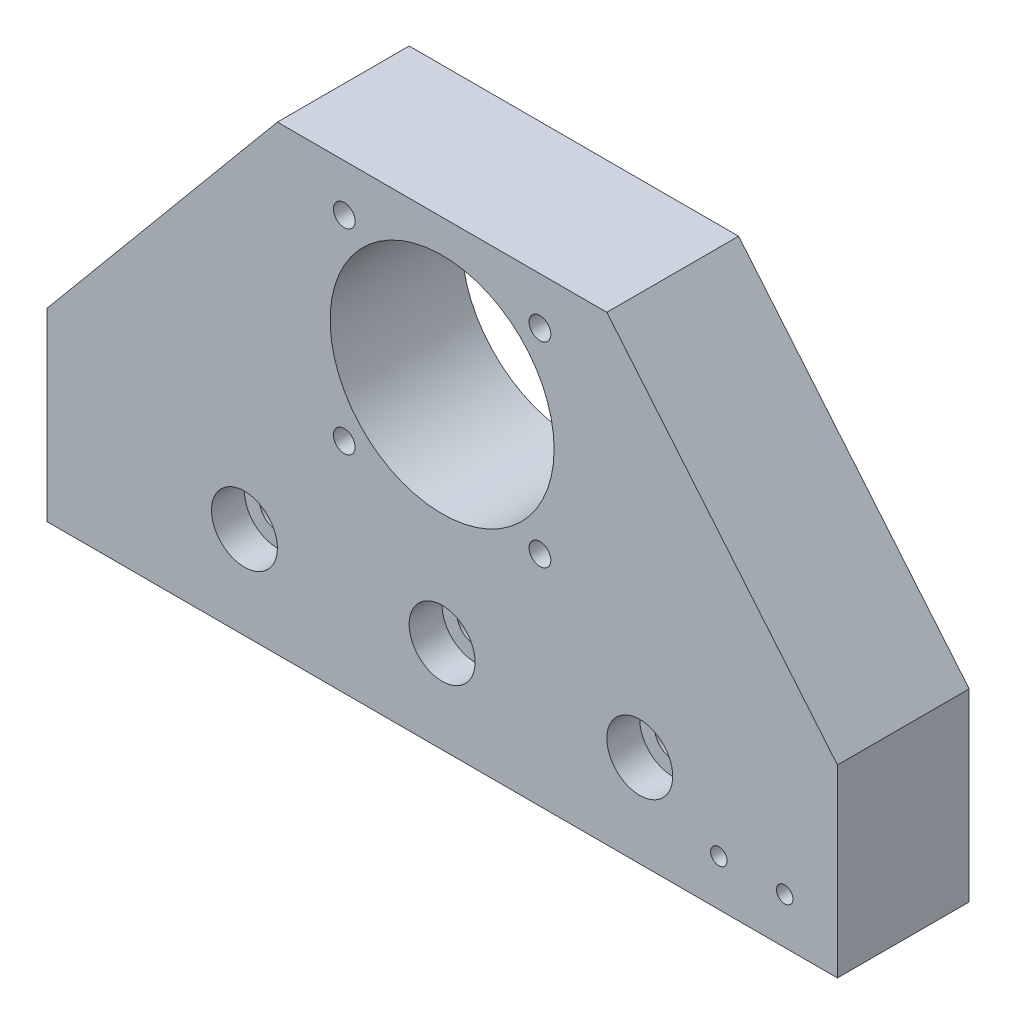
ISO-10303-21;
HEADER;
FILE_DESCRIPTION(('STEP AP214'),'2;1');
FILE_NAME('part.step','',(''),(''),'','','');
FILE_SCHEMA(('AUTOMOTIVE_DESIGN { 1 0 10303 214 1 1 1 1 }'));
ENDSEC;
DATA;
#1=APPLICATION_CONTEXT('core data for automotive mechanical design processes');
#2=APPLICATION_PROTOCOL_DEFINITION('international standard','automotive_design',2000,#1);
#3=PRODUCT_CONTEXT('',#1,'mechanical');
#4=PRODUCT('Part','Part','',(#3));
#5=PRODUCT_RELATED_PRODUCT_CATEGORY('part','',(#4));
#6=PRODUCT_DEFINITION_FORMATION('','',#4);
#7=PRODUCT_DEFINITION_CONTEXT('part definition',#1,'design');
#8=PRODUCT_DEFINITION('design','',#6,#7);
#9=PRODUCT_DEFINITION_SHAPE('','',#8);
#10=(LENGTH_UNIT() NAMED_UNIT(*) SI_UNIT(.MILLI.,.METRE.));
#11=(NAMED_UNIT(*) PLANE_ANGLE_UNIT() SI_UNIT($,.RADIAN.));
#12=(NAMED_UNIT(*) SI_UNIT($,.STERADIAN.) SOLID_ANGLE_UNIT());
#13=UNCERTAINTY_MEASURE_WITH_UNIT(LENGTH_MEASURE(1.E-05),#10,'distance_accuracy_value','');
#14=(GEOMETRIC_REPRESENTATION_CONTEXT(3) GLOBAL_UNCERTAINTY_ASSIGNED_CONTEXT((#13)) GLOBAL_UNIT_ASSIGNED_CONTEXT((#10,
#11,#12)) REPRESENTATION_CONTEXT('',''));
#15=CARTESIAN_POINT('',(0.,0.,0.));
#16=DIRECTION('',(0.,0.,1.));
#17=DIRECTION('',(1.,0.,0.));
#18=AXIS2_PLACEMENT_3D('',#15,#16,#17);
#19=CARTESIAN_POINT('',(-60.,0.,20.));
#20=DIRECTION('',(1.,0.,0.));
#21=DIRECTION('',(0.,0.,-1.));
#22=AXIS2_PLACEMENT_3D('',#19,#20,#21);
#23=PLANE('',#22);
#24=DIRECTION('',(0.,-1.,0.));
#25=VECTOR('',#24,1.);
#26=CARTESIAN_POINT('',(-60.,0.,0.));
#27=LINE('',#26,#25);
#28=CARTESIAN_POINT('',(-60.,28.,0.));
#29=VERTEX_POINT('',#28);
#30=CARTESIAN_POINT('',(-60.,0.,0.));
#31=VERTEX_POINT('',#30);
#32=EDGE_CURVE('E122',#29,#31,#27,.T.);
#33=ORIENTED_EDGE('',*,*,#32,.T.);
#34=DIRECTION('',(0.,0.,-1.));
#35=VECTOR('',#34,1.);
#36=CARTESIAN_POINT('',(-60.,0.,20.));
#37=LINE('',#36,#35);
#38=CARTESIAN_POINT('',(-60.,0.,20.));
#39=VERTEX_POINT('',#38);
#40=EDGE_CURVE('E11',#39,#31,#37,.T.);
#41=ORIENTED_EDGE('',*,*,#40,.F.);
#42=DIRECTION('',(0.,-1.,0.));
#43=VECTOR('',#42,1.);
#44=CARTESIAN_POINT('',(-60.,0.,20.));
#45=LINE('',#44,#43);
#46=CARTESIAN_POINT('',(-60.,28.,20.));
#47=VERTEX_POINT('',#46);
#48=EDGE_CURVE('E133',#47,#39,#45,.T.);
#49=ORIENTED_EDGE('',*,*,#48,.F.);
#50=DIRECTION('',(0.,0.,-1.));
#51=VECTOR('',#50,1.);
#52=CARTESIAN_POINT('',(-60.,28.,20.));
#53=LINE('',#52,#51);
#54=EDGE_CURVE('E118',#47,#29,#53,.T.);
#55=ORIENTED_EDGE('',*,*,#54,.T.);
#56=EDGE_LOOP('',(#33,#41,#49,#55));
#57=FACE_BOUND('',#56,.T.);
#58=ADVANCED_FACE('F35',(#57),#23,.F.);
#59=CARTESIAN_POINT('',(60.,0.,20.));
#60=DIRECTION('',(0.,1.,0.));
#61=DIRECTION('',(0.,0.,1.));
#62=AXIS2_PLACEMENT_3D('',#59,#60,#61);
#63=PLANE('',#62);
#64=CARTESIAN_POINT('',(-20.,0.,10.));
#65=DIRECTION('',(0.,-1.,0.));
#66=DIRECTION('',(0.,0.,-1.));
#67=AXIS2_PLACEMENT_3D('',#64,#65,#66);
#68=CIRCLE('',#67,1.64999999999999);
#69=CARTESIAN_POINT('',(-20.,0.,8.35000000000001));
#70=VERTEX_POINT('',#69);
#71=EDGE_CURVE('E441',#70,#70,#68,.T.);
#72=ORIENTED_EDGE('',*,*,#71,.F.);
#73=EDGE_LOOP('',(#72));
#74=FACE_BOUND('',#73,.T.);
#75=CARTESIAN_POINT('',(20.,0.,10.));
#76=DIRECTION('',(0.,-1.,0.));
#77=DIRECTION('',(0.,0.,-1.));
#78=AXIS2_PLACEMENT_3D('',#75,#76,#77);
#79=CIRCLE('',#78,1.64999999999999);
#80=CARTESIAN_POINT('',(20.,0.,8.35000000000001));
#81=VERTEX_POINT('',#80);
#82=EDGE_CURVE('E447',#81,#81,#79,.T.);
#83=ORIENTED_EDGE('',*,*,#82,.F.);
#84=EDGE_LOOP('',(#83));
#85=FACE_BOUND('',#84,.T.);
#86=DIRECTION('',(1.,0.,0.));
#87=VECTOR('',#86,1.);
#88=CARTESIAN_POINT('',(60.,0.,0.));
#89=LINE('',#88,#87);
#90=CARTESIAN_POINT('',(60.,0.,0.));
#91=VERTEX_POINT('',#90);
#92=EDGE_CURVE('E125',#31,#91,#89,.T.);
#93=ORIENTED_EDGE('',*,*,#92,.T.);
#94=DIRECTION('',(0.,0.,-1.));
#95=VECTOR('',#94,1.);
#96=CARTESIAN_POINT('',(60.,0.,20.));
#97=LINE('',#96,#95);
#98=CARTESIAN_POINT('',(60.,0.,20.));
#99=VERTEX_POINT('',#98);
#100=EDGE_CURVE('E43',#99,#91,#97,.T.);
#101=ORIENTED_EDGE('',*,*,#100,.F.);
#102=DIRECTION('',(1.,0.,0.));
#103=VECTOR('',#102,1.);
#104=CARTESIAN_POINT('',(60.,0.,20.));
#105=LINE('',#104,#103);
#106=EDGE_CURVE('E89',#39,#99,#105,.T.);
#107=ORIENTED_EDGE('',*,*,#106,.F.);
#108=ORIENTED_EDGE('',*,*,#40,.T.);
#109=EDGE_LOOP('',(#93,#101,#107,#108));
#110=FACE_BOUND('',#109,.T.);
#111=ADVANCED_FACE('F159',(#74,#85,#110),#63,.F.);
#112=CARTESIAN_POINT('',(60.,0.,20.));
#113=DIRECTION('',(-1.,0.,0.));
#114=DIRECTION('',(0.,0.,1.));
#115=AXIS2_PLACEMENT_3D('',#112,#113,#114);
#116=PLANE('',#115);
#117=DIRECTION('',(0.,1.,0.));
#118=VECTOR('',#117,1.);
#119=CARTESIAN_POINT('',(60.,0.,0.));
#120=LINE('',#119,#118);
#121=CARTESIAN_POINT('',(60.,28.,0.));
#122=VERTEX_POINT('',#121);
#123=EDGE_CURVE('E128',#91,#122,#120,.T.);
#124=ORIENTED_EDGE('',*,*,#123,.T.);
#125=DIRECTION('',(0.,0.,-1.));
#126=VECTOR('',#125,1.);
#127=CARTESIAN_POINT('',(60.,28.,20.));
#128=LINE('',#127,#126);
#129=CARTESIAN_POINT('',(60.,28.,20.));
#130=VERTEX_POINT('',#129);
#131=EDGE_CURVE('E113',#130,#122,#128,.T.);
#132=ORIENTED_EDGE('',*,*,#131,.F.);
#133=DIRECTION('',(0.,1.,0.));
#134=VECTOR('',#133,1.);
#135=CARTESIAN_POINT('',(60.,0.,20.));
#136=LINE('',#135,#134);
#137=EDGE_CURVE('E104',#99,#130,#136,.T.);
#138=ORIENTED_EDGE('',*,*,#137,.F.);
#139=ORIENTED_EDGE('',*,*,#100,.T.);
#140=EDGE_LOOP('',(#124,#132,#138,#139));
#141=FACE_BOUND('',#140,.T.);
#142=ADVANCED_FACE('F139',(#141),#116,.F.);
#143=CARTESIAN_POINT('',(60.,28.,20.));
#144=DIRECTION('',(-0.768221279597376,-0.64018439966448,0.));
#145=DIRECTION('',(0.64018439966448,-0.768221279597376,0.));
#146=AXIS2_PLACEMENT_3D('',#143,#144,#145);
#147=PLANE('',#146);
#148=DIRECTION('',(-0.64018439966448,0.768221279597376,0.));
#149=VECTOR('',#148,1.);
#150=CARTESIAN_POINT('',(60.,28.,0.));
#151=LINE('',#150,#149);
#152=CARTESIAN_POINT('',(25.,70.,0.));
#153=VERTEX_POINT('',#152);
#154=EDGE_CURVE('E112',#122,#153,#151,.T.);
#155=ORIENTED_EDGE('',*,*,#154,.T.);
#156=DIRECTION('',(0.,0.,-1.));
#157=VECTOR('',#156,1.);
#158=CARTESIAN_POINT('',(25.,70.,20.));
#159=LINE('',#158,#157);
#160=CARTESIAN_POINT('',(25.,70.,20.));
#161=VERTEX_POINT('',#160);
#162=EDGE_CURVE('E109',#161,#153,#159,.T.);
#163=ORIENTED_EDGE('',*,*,#162,.F.);
#164=DIRECTION('',(-0.64018439966448,0.768221279597376,0.));
#165=VECTOR('',#164,1.);
#166=CARTESIAN_POINT('',(60.,28.,20.));
#167=LINE('',#166,#165);
#168=EDGE_CURVE('E98',#130,#161,#167,.T.);
#169=ORIENTED_EDGE('',*,*,#168,.F.);
#170=ORIENTED_EDGE('',*,*,#131,.T.);
#171=EDGE_LOOP('',(#155,#163,#169,#170));
#172=FACE_BOUND('',#171,.T.);
#173=ADVANCED_FACE('F110',(#172),#147,.F.);
#174=CARTESIAN_POINT('',(-25.,70.,20.));
#175=DIRECTION('',(0.,-1.,0.));
#176=DIRECTION('',(0.,0.,-1.));
#177=AXIS2_PLACEMENT_3D('',#174,#175,#176);
#178=PLANE('',#177);
#179=DIRECTION('',(-1.,0.,0.));
#180=VECTOR('',#179,1.);
#181=CARTESIAN_POINT('',(-25.,70.,0.));
#182=LINE('',#181,#180);
#183=CARTESIAN_POINT('',(-25.,70.,0.));
#184=VERTEX_POINT('',#183);
#185=EDGE_CURVE('E75',#153,#184,#182,.T.);
#186=ORIENTED_EDGE('',*,*,#185,.T.);
#187=DIRECTION('',(0.,0.,-1.));
#188=VECTOR('',#187,1.);
#189=CARTESIAN_POINT('',(-25.,70.,20.));
#190=LINE('',#189,#188);
#191=CARTESIAN_POINT('',(-25.,70.,20.));
#192=VERTEX_POINT('',#191);
#193=EDGE_CURVE('E114',#192,#184,#190,.T.);
#194=ORIENTED_EDGE('',*,*,#193,.F.);
#195=DIRECTION('',(-1.,0.,0.));
#196=VECTOR('',#195,1.);
#197=CARTESIAN_POINT('',(-25.,70.,20.));
#198=LINE('',#197,#196);
#199=EDGE_CURVE('E102',#161,#192,#198,.T.);
#200=ORIENTED_EDGE('',*,*,#199,.F.);
#201=ORIENTED_EDGE('',*,*,#162,.T.);
#202=EDGE_LOOP('',(#186,#194,#200,#201));
#203=FACE_BOUND('',#202,.T.);
#204=ADVANCED_FACE('F116',(#203),#178,.F.);
#205=CARTESIAN_POINT('',(-60.,28.,20.));
#206=DIRECTION('',(0.768221279597376,-0.64018439966448,0.));
#207=DIRECTION('',(0.64018439966448,0.768221279597376,0.));
#208=AXIS2_PLACEMENT_3D('',#205,#206,#207);
#209=PLANE('',#208);
#210=DIRECTION('',(-0.64018439966448,-0.768221279597376,0.));
#211=VECTOR('',#210,1.);
#212=CARTESIAN_POINT('',(-60.,28.,0.));
#213=LINE('',#212,#211);
#214=EDGE_CURVE('E81',#184,#29,#213,.T.);
#215=ORIENTED_EDGE('',*,*,#214,.T.);
#216=ORIENTED_EDGE('',*,*,#54,.F.);
#217=DIRECTION('',(-0.64018439966448,-0.768221279597376,0.));
#218=VECTOR('',#217,1.);
#219=CARTESIAN_POINT('',(-60.,28.,20.));
#220=LINE('',#219,#218);
#221=EDGE_CURVE('E51',#192,#47,#220,.T.);
#222=ORIENTED_EDGE('',*,*,#221,.F.);
#223=ORIENTED_EDGE('',*,*,#193,.T.);
#224=EDGE_LOOP('',(#215,#216,#222,#223));
#225=FACE_BOUND('',#224,.T.);
#226=ADVANCED_FACE('F146',(#225),#209,.F.);
#227=CARTESIAN_POINT('',(0.,0.,20.));
#228=DIRECTION('',(0.,0.,-1.));
#229=DIRECTION('',(-1.,0.,0.));
#230=AXIS2_PLACEMENT_3D('',#227,#228,#229);
#231=PLANE('',#230);
#232=CARTESIAN_POINT('',(42.,7.,20.));
#233=DIRECTION('',(0.,0.,1.));
#234=DIRECTION('',(1.,0.,0.));
#235=AXIS2_PLACEMENT_3D('',#232,#233,#234);
#236=CIRCLE('',#235,1.24999999999999);
#237=CARTESIAN_POINT('',(43.25,7.,20.));
#238=VERTEX_POINT('',#237);
#239=EDGE_CURVE('E431',#238,#238,#236,.T.);
#240=ORIENTED_EDGE('',*,*,#239,.F.);
#241=EDGE_LOOP('',(#240));
#242=FACE_BOUND('',#241,.T.);
#243=CARTESIAN_POINT('',(52.,7.,20.));
#244=DIRECTION('',(0.,0.,1.));
#245=DIRECTION('',(1.,0.,0.));
#246=AXIS2_PLACEMENT_3D('',#243,#244,#245);
#247=CIRCLE('',#246,1.24999999999999);
#248=CARTESIAN_POINT('',(53.25,7.,20.));
#249=VERTEX_POINT('',#248);
#250=EDGE_CURVE('E433',#249,#249,#247,.T.);
#251=ORIENTED_EDGE('',*,*,#250,.F.);
#252=EDGE_LOOP('',(#251));
#253=FACE_BOUND('',#252,.T.);
#254=CARTESIAN_POINT('',(-14.8492424049174,62.8492424049175,20.));
#255=DIRECTION('',(0.,0.,1.));
#256=DIRECTION('',(1.,0.,0.));
#257=AXIS2_PLACEMENT_3D('',#254,#255,#256);
#258=CIRCLE('',#257,1.64999999999999);
#259=CARTESIAN_POINT('',(-13.1992424049175,62.8492424049175,20.));
#260=VERTEX_POINT('',#259);
#261=EDGE_CURVE('E453',#260,#260,#258,.T.);
#262=ORIENTED_EDGE('',*,*,#261,.F.);
#263=EDGE_LOOP('',(#262));
#264=FACE_BOUND('',#263,.T.);
#265=CARTESIAN_POINT('',(14.8492424049176,62.8492424049175,20.));
#266=DIRECTION('',(0.,0.,1.));
#267=DIRECTION('',(1.,0.,0.));
#268=AXIS2_PLACEMENT_3D('',#265,#266,#267);
#269=CIRCLE('',#268,1.64999999999999);
#270=CARTESIAN_POINT('',(16.4992424049175,62.8492424049175,20.));
#271=VERTEX_POINT('',#270);
#272=EDGE_CURVE('E459',#271,#271,#269,.T.);
#273=ORIENTED_EDGE('',*,*,#272,.F.);
#274=EDGE_LOOP('',(#273));
#275=FACE_BOUND('',#274,.T.);
#276=CARTESIAN_POINT('',(14.8492424049176,33.1507575950825,20.));
#277=DIRECTION('',(0.,0.,1.));
#278=DIRECTION('',(1.,0.,0.));
#279=AXIS2_PLACEMENT_3D('',#276,#277,#278);
#280=CIRCLE('',#279,1.64999999999999);
#281=CARTESIAN_POINT('',(16.4992424049175,33.1507575950825,20.));
#282=VERTEX_POINT('',#281);
#283=EDGE_CURVE('E465',#282,#282,#280,.T.);
#284=ORIENTED_EDGE('',*,*,#283,.F.);
#285=EDGE_LOOP('',(#284));
#286=FACE_BOUND('',#285,.T.);
#287=CARTESIAN_POINT('',(-14.8492424049174,33.1507575950825,20.));
#288=DIRECTION('',(0.,0.,1.));
#289=DIRECTION('',(1.,0.,0.));
#290=AXIS2_PLACEMENT_3D('',#287,#288,#289);
#291=CIRCLE('',#290,1.64999999999999);
#292=CARTESIAN_POINT('',(-13.1992424049175,33.1507575950825,20.));
#293=VERTEX_POINT('',#292);
#294=EDGE_CURVE('E471',#293,#293,#291,.T.);
#295=ORIENTED_EDGE('',*,*,#294,.F.);
#296=EDGE_LOOP('',(#295));
#297=FACE_BOUND('',#296,.T.);
#298=CARTESIAN_POINT('',(0.,48.,20.));
#299=DIRECTION('',(0.,0.,1.));
#300=DIRECTION('',(1.,0.,0.));
#301=AXIS2_PLACEMENT_3D('',#298,#299,#300);
#302=CIRCLE('',#301,17.);
#303=CARTESIAN_POINT('',(17.0000000000001,48.,20.));
#304=VERTEX_POINT('',#303);
#305=EDGE_CURVE('E477',#304,#304,#302,.T.);
#306=ORIENTED_EDGE('',*,*,#305,.F.);
#307=EDGE_LOOP('',(#306));
#308=FACE_BOUND('',#307,.T.);
#309=CARTESIAN_POINT('',(-30.,14.,20.));
#310=DIRECTION('',(0.,0.,1.));
#311=DIRECTION('',(1.,0.,0.));
#312=AXIS2_PLACEMENT_3D('',#309,#310,#311);
#313=CIRCLE('',#312,5.);
#314=CARTESIAN_POINT('',(-25.,14.,20.));
#315=VERTEX_POINT('',#314);
#316=EDGE_CURVE('E481',#315,#315,#313,.T.);
#317=ORIENTED_EDGE('',*,*,#316,.F.);
#318=EDGE_LOOP('',(#317));
#319=FACE_BOUND('',#318,.T.);
#320=CARTESIAN_POINT('',(0.,14.,20.));
#321=DIRECTION('',(0.,0.,1.));
#322=DIRECTION('',(1.,0.,0.));
#323=AXIS2_PLACEMENT_3D('',#320,#321,#322);
#324=CIRCLE('',#323,5.);
#325=CARTESIAN_POINT('',(5.,14.,20.));
#326=VERTEX_POINT('',#325);
#327=EDGE_CURVE('E495',#326,#326,#324,.T.);
#328=ORIENTED_EDGE('',*,*,#327,.F.);
#329=EDGE_LOOP('',(#328));
#330=FACE_BOUND('',#329,.T.);
#331=CARTESIAN_POINT('',(30.,14.,20.));
#332=DIRECTION('',(0.,0.,1.));
#333=DIRECTION('',(1.,0.,0.));
#334=AXIS2_PLACEMENT_3D('',#331,#332,#333);
#335=CIRCLE('',#334,5.);
#336=CARTESIAN_POINT('',(35.,14.,20.));
#337=VERTEX_POINT('',#336);
#338=EDGE_CURVE('E507',#337,#337,#335,.T.);
#339=ORIENTED_EDGE('',*,*,#338,.F.);
#340=EDGE_LOOP('',(#339));
#341=FACE_BOUND('',#340,.T.);
#342=ORIENTED_EDGE('',*,*,#48,.T.);
#343=ORIENTED_EDGE('',*,*,#106,.T.);
#344=ORIENTED_EDGE('',*,*,#137,.T.);
#345=ORIENTED_EDGE('',*,*,#168,.T.);
#346=ORIENTED_EDGE('',*,*,#199,.T.);
#347=ORIENTED_EDGE('',*,*,#221,.T.);
#348=EDGE_LOOP('',(#342,#343,#344,#345,#346,#347));
#349=FACE_BOUND('',#348,.T.);
#350=ADVANCED_FACE('F100',(#242,#253,#264,#275,#286,#297,#308,#319,#330,#341,#349),#231,.F.);
#351=CARTESIAN_POINT('',(0.,0.,0.));
#352=DIRECTION('',(0.,0.,-1.));
#353=DIRECTION('',(-1.,0.,0.));
#354=AXIS2_PLACEMENT_3D('',#351,#352,#353);
#355=PLANE('',#354);
#356=CARTESIAN_POINT('',(-14.8492424049174,62.8492424049175,0.));
#357=DIRECTION('',(0.,0.,1.));
#358=DIRECTION('',(1.,0.,0.));
#359=AXIS2_PLACEMENT_3D('',#356,#357,#358);
#360=CIRCLE('',#359,1.65);
#361=CARTESIAN_POINT('',(-13.1992424049175,62.8492424049175,0.));
#362=VERTEX_POINT('',#361);
#363=EDGE_CURVE('E456',#362,#362,#360,.T.);
#364=ORIENTED_EDGE('',*,*,#363,.T.);
#365=EDGE_LOOP('',(#364));
#366=FACE_BOUND('',#365,.T.);
#367=CARTESIAN_POINT('',(14.8492424049176,62.8492424049175,0.));
#368=DIRECTION('',(0.,0.,1.));
#369=DIRECTION('',(1.,0.,0.));
#370=AXIS2_PLACEMENT_3D('',#367,#368,#369);
#371=CIRCLE('',#370,1.65);
#372=CARTESIAN_POINT('',(16.4992424049176,62.8492424049175,0.));
#373=VERTEX_POINT('',#372);
#374=EDGE_CURVE('E462',#373,#373,#371,.T.);
#375=ORIENTED_EDGE('',*,*,#374,.T.);
#376=EDGE_LOOP('',(#375));
#377=FACE_BOUND('',#376,.T.);
#378=CARTESIAN_POINT('',(14.8492424049176,33.1507575950825,0.));
#379=DIRECTION('',(0.,0.,1.));
#380=DIRECTION('',(1.,0.,0.));
#381=AXIS2_PLACEMENT_3D('',#378,#379,#380);
#382=CIRCLE('',#381,1.65);
#383=CARTESIAN_POINT('',(16.4992424049176,33.1507575950825,0.));
#384=VERTEX_POINT('',#383);
#385=EDGE_CURVE('E468',#384,#384,#382,.T.);
#386=ORIENTED_EDGE('',*,*,#385,.T.);
#387=EDGE_LOOP('',(#386));
#388=FACE_BOUND('',#387,.T.);
#389=CARTESIAN_POINT('',(-14.8492424049174,33.1507575950825,0.));
#390=DIRECTION('',(0.,0.,1.));
#391=DIRECTION('',(1.,0.,0.));
#392=AXIS2_PLACEMENT_3D('',#389,#390,#391);
#393=CIRCLE('',#392,1.65);
#394=CARTESIAN_POINT('',(-13.1992424049175,33.1507575950825,0.));
#395=VERTEX_POINT('',#394);
#396=EDGE_CURVE('E474',#395,#395,#393,.T.);
#397=ORIENTED_EDGE('',*,*,#396,.T.);
#398=EDGE_LOOP('',(#397));
#399=FACE_BOUND('',#398,.T.);
#400=CARTESIAN_POINT('',(0.,48.,0.));
#401=DIRECTION('',(0.,0.,1.));
#402=DIRECTION('',(1.,0.,0.));
#403=AXIS2_PLACEMENT_3D('',#400,#401,#402);
#404=CIRCLE('',#403,17.);
#405=CARTESIAN_POINT('',(17.0000000000001,48.,0.));
#406=VERTEX_POINT('',#405);
#407=EDGE_CURVE('E478',#406,#406,#404,.T.);
#408=ORIENTED_EDGE('',*,*,#407,.T.);
#409=EDGE_LOOP('',(#408));
#410=FACE_BOUND('',#409,.T.);
#411=CARTESIAN_POINT('',(-30.,14.,0.));
#412=DIRECTION('',(0.,0.,1.));
#413=DIRECTION('',(1.,0.,0.));
#414=AXIS2_PLACEMENT_3D('',#411,#412,#413);
#415=CIRCLE('',#414,2.75);
#416=CARTESIAN_POINT('',(-27.25,14.,0.));
#417=VERTEX_POINT('',#416);
#418=EDGE_CURVE('E492',#417,#417,#415,.T.);
#419=ORIENTED_EDGE('',*,*,#418,.T.);
#420=EDGE_LOOP('',(#419));
#421=FACE_BOUND('',#420,.T.);
#422=CARTESIAN_POINT('',(0.,14.,0.));
#423=DIRECTION('',(0.,0.,1.));
#424=DIRECTION('',(1.,0.,0.));
#425=AXIS2_PLACEMENT_3D('',#422,#423,#424);
#426=CIRCLE('',#425,2.74999999999999);
#427=CARTESIAN_POINT('',(2.74999999999999,14.,0.));
#428=VERTEX_POINT('',#427);
#429=EDGE_CURVE('E504',#428,#428,#426,.T.);
#430=ORIENTED_EDGE('',*,*,#429,.T.);
#431=EDGE_LOOP('',(#430));
#432=FACE_BOUND('',#431,.T.);
#433=CARTESIAN_POINT('',(30.,14.,0.));
#434=DIRECTION('',(0.,0.,1.));
#435=DIRECTION('',(1.,0.,0.));
#436=AXIS2_PLACEMENT_3D('',#433,#434,#435);
#437=CIRCLE('',#436,2.75);
#438=CARTESIAN_POINT('',(32.75,14.,0.));
#439=VERTEX_POINT('',#438);
#440=EDGE_CURVE('E126',#439,#439,#437,.T.);
#441=ORIENTED_EDGE('',*,*,#440,.T.);
#442=EDGE_LOOP('',(#441));
#443=FACE_BOUND('',#442,.T.);
#444=ORIENTED_EDGE('',*,*,#32,.F.);
#445=ORIENTED_EDGE('',*,*,#214,.F.);
#446=ORIENTED_EDGE('',*,*,#185,.F.);
#447=ORIENTED_EDGE('',*,*,#154,.F.);
#448=ORIENTED_EDGE('',*,*,#123,.F.);
#449=ORIENTED_EDGE('',*,*,#92,.F.);
#450=EDGE_LOOP('',(#444,#445,#446,#447,#448,#449));
#451=FACE_BOUND('',#450,.T.);
#452=ADVANCED_FACE('F142',(#366,#377,#388,#399,#410,#421,#432,#443,#451),#355,.T.);
#453=CARTESIAN_POINT('',(30.,14.,20.));
#454=DIRECTION('',(0.,0.,1.));
#455=DIRECTION('',(1.,0.,0.));
#456=AXIS2_PLACEMENT_3D('',#453,#454,#455);
#457=CYLINDRICAL_SURFACE('',#456,2.75);
#458=ORIENTED_EDGE('',*,*,#440,.F.);
#459=EDGE_LOOP('',(#458));
#460=FACE_BOUND('',#459,.T.);
#461=CARTESIAN_POINT('',(30.,14.,15.));
#462=DIRECTION('',(0.,0.,1.));
#463=DIRECTION('',(1.,0.,0.));
#464=AXIS2_PLACEMENT_3D('',#461,#462,#463);
#465=CIRCLE('',#464,2.75);
#466=CARTESIAN_POINT('',(32.75,14.,15.));
#467=VERTEX_POINT('',#466);
#468=EDGE_CURVE('E513',#467,#467,#465,.T.);
#469=ORIENTED_EDGE('',*,*,#468,.T.);
#470=EDGE_LOOP('',(#469));
#471=FACE_BOUND('',#470,.T.);
#472=ADVANCED_FACE('F190',(#460,#471),#457,.F.);
#473=CARTESIAN_POINT('',(32.75,14.,15.));
#474=DIRECTION('',(0.,0.,-1.));
#475=DIRECTION('',(-1.,0.,0.));
#476=AXIS2_PLACEMENT_3D('',#473,#474,#475);
#477=PLANE('',#476);
#478=ORIENTED_EDGE('',*,*,#468,.F.);
#479=EDGE_LOOP('',(#478));
#480=FACE_BOUND('',#479,.T.);
#481=CARTESIAN_POINT('',(30.,14.,15.));
#482=DIRECTION('',(0.,0.,1.));
#483=DIRECTION('',(1.,0.,0.));
#484=AXIS2_PLACEMENT_3D('',#481,#482,#483);
#485=CIRCLE('',#484,5.);
#486=CARTESIAN_POINT('',(35.,14.,15.));
#487=VERTEX_POINT('',#486);
#488=EDGE_CURVE('E510',#487,#487,#485,.T.);
#489=ORIENTED_EDGE('',*,*,#488,.T.);
#490=EDGE_LOOP('',(#489));
#491=FACE_BOUND('',#490,.T.);
#492=ADVANCED_FACE('F195',(#480,#491),#477,.F.);
#493=CARTESIAN_POINT('',(30.,14.,20.));
#494=DIRECTION('',(0.,0.,1.));
#495=DIRECTION('',(1.,0.,0.));
#496=AXIS2_PLACEMENT_3D('',#493,#494,#495);
#497=CYLINDRICAL_SURFACE('',#496,5.);
#498=ORIENTED_EDGE('',*,*,#488,.F.);
#499=EDGE_LOOP('',(#498));
#500=FACE_BOUND('',#499,.T.);
#501=ORIENTED_EDGE('',*,*,#338,.T.);
#502=EDGE_LOOP('',(#501));
#503=FACE_BOUND('',#502,.T.);
#504=ADVANCED_FACE('F207',(#500,#503),#497,.F.);
#505=CARTESIAN_POINT('',(0.,14.,20.));
#506=DIRECTION('',(0.,0.,1.));
#507=DIRECTION('',(1.,0.,0.));
#508=AXIS2_PLACEMENT_3D('',#505,#506,#507);
#509=CYLINDRICAL_SURFACE('',#508,2.75);
#510=ORIENTED_EDGE('',*,*,#429,.F.);
#511=EDGE_LOOP('',(#510));
#512=FACE_BOUND('',#511,.T.);
#513=CARTESIAN_POINT('',(0.,14.,15.));
#514=DIRECTION('',(0.,0.,1.));
#515=DIRECTION('',(1.,0.,0.));
#516=AXIS2_PLACEMENT_3D('',#513,#514,#515);
#517=CIRCLE('',#516,2.75);
#518=CARTESIAN_POINT('',(2.75,14.,15.));
#519=VERTEX_POINT('',#518);
#520=EDGE_CURVE('E501',#519,#519,#517,.T.);
#521=ORIENTED_EDGE('',*,*,#520,.T.);
#522=EDGE_LOOP('',(#521));
#523=FACE_BOUND('',#522,.T.);
#524=ADVANCED_FACE('F217',(#512,#523),#509,.F.);
#525=CARTESIAN_POINT('',(2.75,14.,15.));
#526=DIRECTION('',(0.,0.,-1.));
#527=DIRECTION('',(-1.,0.,0.));
#528=AXIS2_PLACEMENT_3D('',#525,#526,#527);
#529=PLANE('',#528);
#530=ORIENTED_EDGE('',*,*,#520,.F.);
#531=EDGE_LOOP('',(#530));
#532=FACE_BOUND('',#531,.T.);
#533=CARTESIAN_POINT('',(0.,14.,15.));
#534=DIRECTION('',(0.,0.,1.));
#535=DIRECTION('',(1.,0.,0.));
#536=AXIS2_PLACEMENT_3D('',#533,#534,#535);
#537=CIRCLE('',#536,5.);
#538=CARTESIAN_POINT('',(5.,14.,15.));
#539=VERTEX_POINT('',#538);
#540=EDGE_CURVE('E498',#539,#539,#537,.T.);
#541=ORIENTED_EDGE('',*,*,#540,.T.);
#542=EDGE_LOOP('',(#541));
#543=FACE_BOUND('',#542,.T.);
#544=ADVANCED_FACE('F227',(#532,#543),#529,.F.);
#545=CARTESIAN_POINT('',(0.,14.,20.));
#546=DIRECTION('',(0.,0.,1.));
#547=DIRECTION('',(1.,0.,0.));
#548=AXIS2_PLACEMENT_3D('',#545,#546,#547);
#549=CYLINDRICAL_SURFACE('',#548,5.);
#550=ORIENTED_EDGE('',*,*,#540,.F.);
#551=EDGE_LOOP('',(#550));
#552=FACE_BOUND('',#551,.T.);
#553=ORIENTED_EDGE('',*,*,#327,.T.);
#554=EDGE_LOOP('',(#553));
#555=FACE_BOUND('',#554,.T.);
#556=ADVANCED_FACE('F237',(#552,#555),#549,.F.);
#557=CARTESIAN_POINT('',(-30.,14.,20.));
#558=DIRECTION('',(0.,0.,1.));
#559=DIRECTION('',(1.,0.,0.));
#560=AXIS2_PLACEMENT_3D('',#557,#558,#559);
#561=CYLINDRICAL_SURFACE('',#560,2.75);
#562=ORIENTED_EDGE('',*,*,#418,.F.);
#563=EDGE_LOOP('',(#562));
#564=FACE_BOUND('',#563,.T.);
#565=CARTESIAN_POINT('',(-30.,14.,15.));
#566=DIRECTION('',(0.,0.,1.));
#567=DIRECTION('',(1.,0.,0.));
#568=AXIS2_PLACEMENT_3D('',#565,#566,#567);
#569=CIRCLE('',#568,2.75);
#570=CARTESIAN_POINT('',(-27.25,14.,15.));
#571=VERTEX_POINT('',#570);
#572=EDGE_CURVE('E489',#571,#571,#569,.T.);
#573=ORIENTED_EDGE('',*,*,#572,.T.);
#574=EDGE_LOOP('',(#573));
#575=FACE_BOUND('',#574,.T.);
#576=ADVANCED_FACE('F247',(#564,#575),#561,.F.);
#577=CARTESIAN_POINT('',(-27.25,14.,15.));
#578=DIRECTION('',(0.,0.,-1.));
#579=DIRECTION('',(-1.,0.,0.));
#580=AXIS2_PLACEMENT_3D('',#577,#578,#579);
#581=PLANE('',#580);
#582=ORIENTED_EDGE('',*,*,#572,.F.);
#583=EDGE_LOOP('',(#582));
#584=FACE_BOUND('',#583,.T.);
#585=CARTESIAN_POINT('',(-30.,14.,15.));
#586=DIRECTION('',(0.,0.,1.));
#587=DIRECTION('',(1.,0.,0.));
#588=AXIS2_PLACEMENT_3D('',#585,#586,#587);
#589=CIRCLE('',#588,5.);
#590=CARTESIAN_POINT('',(-25.,14.,15.));
#591=VERTEX_POINT('',#590);
#592=EDGE_CURVE('E486',#591,#591,#589,.T.);
#593=ORIENTED_EDGE('',*,*,#592,.T.);
#594=EDGE_LOOP('',(#593));
#595=FACE_BOUND('',#594,.T.);
#596=ADVANCED_FACE('F257',(#584,#595),#581,.F.);
#597=CARTESIAN_POINT('',(-30.,14.,20.));
#598=DIRECTION('',(0.,0.,1.));
#599=DIRECTION('',(1.,0.,0.));
#600=AXIS2_PLACEMENT_3D('',#597,#598,#599);
#601=CYLINDRICAL_SURFACE('',#600,5.);
#602=ORIENTED_EDGE('',*,*,#592,.F.);
#603=EDGE_LOOP('',(#602));
#604=FACE_BOUND('',#603,.T.);
#605=ORIENTED_EDGE('',*,*,#316,.T.);
#606=EDGE_LOOP('',(#605));
#607=FACE_BOUND('',#606,.T.);
#608=ADVANCED_FACE('F267',(#604,#607),#601,.F.);
#609=CARTESIAN_POINT('',(0.,48.,0.));
#610=DIRECTION('',(0.,0.,1.));
#611=DIRECTION('',(1.,0.,0.));
#612=AXIS2_PLACEMENT_3D('',#609,#610,#611);
#613=CYLINDRICAL_SURFACE('',#612,17.);
#614=ORIENTED_EDGE('',*,*,#407,.F.);
#615=EDGE_LOOP('',(#614));
#616=FACE_BOUND('',#615,.T.);
#617=ORIENTED_EDGE('',*,*,#305,.T.);
#618=EDGE_LOOP('',(#617));
#619=FACE_BOUND('',#618,.T.);
#620=ADVANCED_FACE('F277',(#616,#619),#613,.F.);
#621=CARTESIAN_POINT('',(-14.8492424049174,33.1507575950825,20.));
#622=DIRECTION('',(0.,0.,1.));
#623=DIRECTION('',(1.,0.,0.));
#624=AXIS2_PLACEMENT_3D('',#621,#622,#623);
#625=CYLINDRICAL_SURFACE('',#624,1.64999999999999);
#626=ORIENTED_EDGE('',*,*,#396,.F.);
#627=EDGE_LOOP('',(#626));
#628=FACE_BOUND('',#627,.T.);
#629=ORIENTED_EDGE('',*,*,#294,.T.);
#630=EDGE_LOOP('',(#629));
#631=FACE_BOUND('',#630,.T.);
#632=ADVANCED_FACE('F287',(#628,#631),#625,.F.);
#633=CARTESIAN_POINT('',(14.8492424049176,33.1507575950825,20.));
#634=DIRECTION('',(0.,0.,1.));
#635=DIRECTION('',(1.,0.,0.));
#636=AXIS2_PLACEMENT_3D('',#633,#634,#635);
#637=CYLINDRICAL_SURFACE('',#636,1.64999999999999);
#638=ORIENTED_EDGE('',*,*,#385,.F.);
#639=EDGE_LOOP('',(#638));
#640=FACE_BOUND('',#639,.T.);
#641=ORIENTED_EDGE('',*,*,#283,.T.);
#642=EDGE_LOOP('',(#641));
#643=FACE_BOUND('',#642,.T.);
#644=ADVANCED_FACE('F303',(#640,#643),#637,.F.);
#645=CARTESIAN_POINT('',(14.8492424049176,62.8492424049175,20.));
#646=DIRECTION('',(0.,0.,1.));
#647=DIRECTION('',(1.,0.,0.));
#648=AXIS2_PLACEMENT_3D('',#645,#646,#647);
#649=CYLINDRICAL_SURFACE('',#648,1.64999999999999);
#650=ORIENTED_EDGE('',*,*,#374,.F.);
#651=EDGE_LOOP('',(#650));
#652=FACE_BOUND('',#651,.T.);
#653=ORIENTED_EDGE('',*,*,#272,.T.);
#654=EDGE_LOOP('',(#653));
#655=FACE_BOUND('',#654,.T.);
#656=ADVANCED_FACE('F313',(#652,#655),#649,.F.);
#657=CARTESIAN_POINT('',(-14.8492424049174,62.8492424049175,20.));
#658=DIRECTION('',(0.,0.,1.));
#659=DIRECTION('',(1.,0.,0.));
#660=AXIS2_PLACEMENT_3D('',#657,#658,#659);
#661=CYLINDRICAL_SURFACE('',#660,1.64999999999999);
#662=ORIENTED_EDGE('',*,*,#363,.F.);
#663=EDGE_LOOP('',(#662));
#664=FACE_BOUND('',#663,.T.);
#665=ORIENTED_EDGE('',*,*,#261,.T.);
#666=EDGE_LOOP('',(#665));
#667=FACE_BOUND('',#666,.T.);
#668=ADVANCED_FACE('F323',(#664,#667),#661,.F.);
#669=CARTESIAN_POINT('',(20.,15.,10.));
#670=DIRECTION('',(0.,-1.,0.));
#671=DIRECTION('',(0.,0.,-1.));
#672=AXIS2_PLACEMENT_3D('',#669,#670,#671);
#673=CONICAL_SURFACE('',#672,1.65,1.02974425867665);
#674=CARTESIAN_POINT('',(20.,15.9914200213955,10.));
#675=VERTEX_POINT('',#674);
#676=VERTEX_LOOP('',#675);
#677=FACE_BOUND('',#676,.T.);
#678=CARTESIAN_POINT('',(20.,15.,10.));
#679=DIRECTION('',(0.,-1.,0.));
#680=DIRECTION('',(0.,0.,-1.));
#681=AXIS2_PLACEMENT_3D('',#678,#679,#680);
#682=CIRCLE('',#681,1.65);
#683=CARTESIAN_POINT('',(20.,15.,8.35));
#684=VERTEX_POINT('',#683);
#685=EDGE_CURVE('E450',#684,#684,#682,.T.);
#686=ORIENTED_EDGE('',*,*,#685,.T.);
#687=EDGE_LOOP('',(#686));
#688=FACE_BOUND('',#687,.T.);
#689=ADVANCED_FACE('F332',(#677,#688),#673,.F.);
#690=CARTESIAN_POINT('',(20.,0.,10.));
#691=DIRECTION('',(0.,-1.,0.));
#692=DIRECTION('',(0.,0.,-1.));
#693=AXIS2_PLACEMENT_3D('',#690,#691,#692);
#694=CYLINDRICAL_SURFACE('',#693,1.64999999999999);
#695=ORIENTED_EDGE('',*,*,#685,.F.);
#696=EDGE_LOOP('',(#695));
#697=FACE_BOUND('',#696,.T.);
#698=ORIENTED_EDGE('',*,*,#82,.T.);
#699=EDGE_LOOP('',(#698));
#700=FACE_BOUND('',#699,.T.);
#701=ADVANCED_FACE('F349',(#697,#700),#694,.F.);
#702=CARTESIAN_POINT('',(-20.,15.,10.));
#703=DIRECTION('',(0.,-1.,0.));
#704=DIRECTION('',(0.,0.,-1.));
#705=AXIS2_PLACEMENT_3D('',#702,#703,#704);
#706=CONICAL_SURFACE('',#705,1.65,1.02974425867665);
#707=CARTESIAN_POINT('',(-20.,15.9914200213955,10.));
#708=VERTEX_POINT('',#707);
#709=VERTEX_LOOP('',#708);
#710=FACE_BOUND('',#709,.T.);
#711=CARTESIAN_POINT('',(-20.,15.,10.));
#712=DIRECTION('',(0.,-1.,0.));
#713=DIRECTION('',(0.,0.,-1.));
#714=AXIS2_PLACEMENT_3D('',#711,#712,#713);
#715=CIRCLE('',#714,1.65);
#716=CARTESIAN_POINT('',(-20.,15.,8.35));
#717=VERTEX_POINT('',#716);
#718=EDGE_CURVE('E444',#717,#717,#715,.T.);
#719=ORIENTED_EDGE('',*,*,#718,.T.);
#720=EDGE_LOOP('',(#719));
#721=FACE_BOUND('',#720,.T.);
#722=ADVANCED_FACE('F359',(#710,#721),#706,.F.);
#723=CARTESIAN_POINT('',(-20.,0.,10.));
#724=DIRECTION('',(0.,-1.,0.));
#725=DIRECTION('',(0.,0.,-1.));
#726=AXIS2_PLACEMENT_3D('',#723,#724,#725);
#727=CYLINDRICAL_SURFACE('',#726,1.64999999999999);
#728=ORIENTED_EDGE('',*,*,#718,.F.);
#729=EDGE_LOOP('',(#728));
#730=FACE_BOUND('',#729,.T.);
#731=ORIENTED_EDGE('',*,*,#71,.T.);
#732=EDGE_LOOP('',(#731));
#733=FACE_BOUND('',#732,.T.);
#734=ADVANCED_FACE('F369',(#730,#733),#727,.F.);
#735=CARTESIAN_POINT('',(52.,7.,12.5));
#736=DIRECTION('',(0.,0.,1.));
#737=DIRECTION('',(1.,0.,0.));
#738=AXIS2_PLACEMENT_3D('',#735,#736,#737);
#739=CONICAL_SURFACE('',#738,1.24999999999999,1.02974425867665);
#740=CARTESIAN_POINT('',(52.,7.,11.7489242262155));
#741=VERTEX_POINT('',#740);
#742=VERTEX_LOOP('',#741);
#743=FACE_BOUND('',#742,.T.);
#744=CARTESIAN_POINT('',(52.,7.,12.5));
#745=DIRECTION('',(0.,0.,1.));
#746=DIRECTION('',(1.,0.,0.));
#747=AXIS2_PLACEMENT_3D('',#744,#745,#746);
#748=CIRCLE('',#747,1.24999999999999);
#749=CARTESIAN_POINT('',(53.25,7.,12.5));
#750=VERTEX_POINT('',#749);
#751=EDGE_CURVE('E438',#750,#750,#748,.T.);
#752=ORIENTED_EDGE('',*,*,#751,.T.);
#753=EDGE_LOOP('',(#752));
#754=FACE_BOUND('',#753,.T.);
#755=ADVANCED_FACE('F378',(#743,#754),#739,.F.);
#756=CARTESIAN_POINT('',(52.,7.,20.));
#757=DIRECTION('',(0.,0.,1.));
#758=DIRECTION('',(1.,0.,0.));
#759=AXIS2_PLACEMENT_3D('',#756,#757,#758);
#760=CYLINDRICAL_SURFACE('',#759,1.24999999999999);
#761=ORIENTED_EDGE('',*,*,#751,.F.);
#762=EDGE_LOOP('',(#761));
#763=FACE_BOUND('',#762,.T.);
#764=ORIENTED_EDGE('',*,*,#250,.T.);
#765=EDGE_LOOP('',(#764));
#766=FACE_BOUND('',#765,.T.);
#767=ADVANCED_FACE('F391',(#763,#766),#760,.F.);
#768=CARTESIAN_POINT('',(42.,7.,12.5));
#769=DIRECTION('',(0.,0.,1.));
#770=DIRECTION('',(1.,0.,0.));
#771=AXIS2_PLACEMENT_3D('',#768,#769,#770);
#772=CONICAL_SURFACE('',#771,1.24999999999999,1.02974425867665);
#773=CARTESIAN_POINT('',(42.,7.,11.7489242262155));
#774=VERTEX_POINT('',#773);
#775=VERTEX_LOOP('',#774);
#776=FACE_BOUND('',#775,.T.);
#777=CARTESIAN_POINT('',(42.,7.,12.5));
#778=DIRECTION('',(0.,0.,1.));
#779=DIRECTION('',(1.,0.,0.));
#780=AXIS2_PLACEMENT_3D('',#777,#778,#779);
#781=CIRCLE('',#780,1.24999999999999);
#782=CARTESIAN_POINT('',(43.25,7.,12.5));
#783=VERTEX_POINT('',#782);
#784=EDGE_CURVE('E428',#783,#783,#781,.T.);
#785=ORIENTED_EDGE('',*,*,#784,.T.);
#786=EDGE_LOOP('',(#785));
#787=FACE_BOUND('',#786,.T.);
#788=ADVANCED_FACE('F401',(#776,#787),#772,.F.);
#789=CARTESIAN_POINT('',(42.,7.,20.));
#790=DIRECTION('',(0.,0.,1.));
#791=DIRECTION('',(1.,0.,0.));
#792=AXIS2_PLACEMENT_3D('',#789,#790,#791);
#793=CYLINDRICAL_SURFACE('',#792,1.24999999999999);
#794=ORIENTED_EDGE('',*,*,#784,.F.);
#795=EDGE_LOOP('',(#794));
#796=FACE_BOUND('',#795,.T.);
#797=ORIENTED_EDGE('',*,*,#239,.T.);
#798=EDGE_LOOP('',(#797));
#799=FACE_BOUND('',#798,.T.);
#800=ADVANCED_FACE('F411',(#796,#799),#793,.F.);
#801=CLOSED_SHELL('',(#58,#111,#142,#173,#204,#226,#350,#452,#472,#492,#504,#524,#544,#556,#576,
#596,#608,#620,#632,#644,#656,#668,#689,#701,#722,#734,#755,#767,#788,#800));
#802=MANIFOLD_SOLID_BREP('B2',#801);
#803=ADVANCED_BREP_SHAPE_REPRESENTATION('',(#18,#802),#14);
#804=SHAPE_DEFINITION_REPRESENTATION(#9,#803);
ENDSEC;
END-ISO-10303-21;
